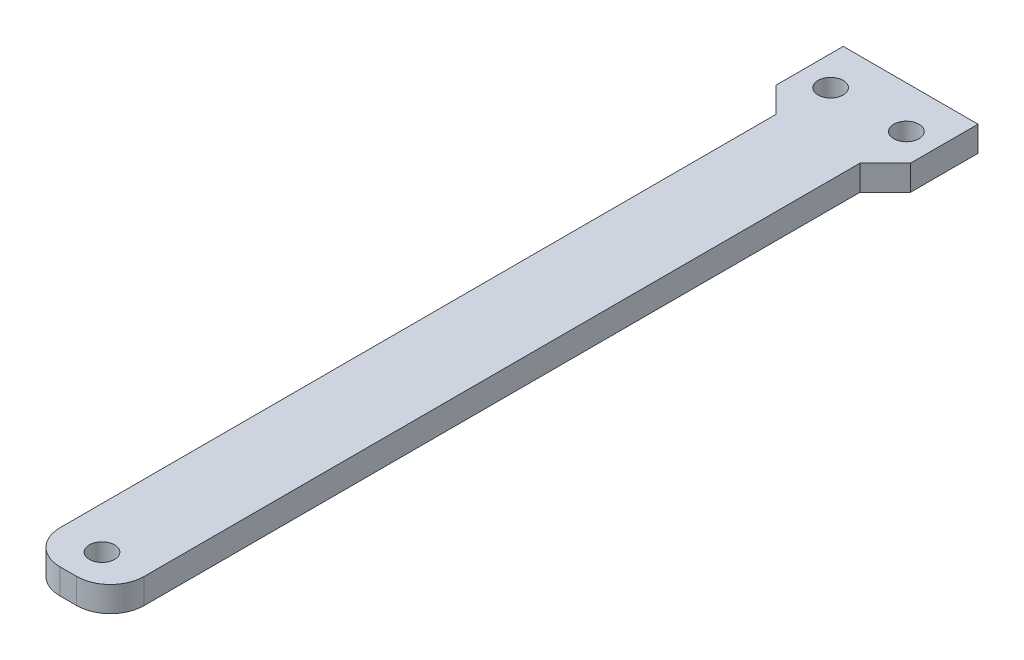
ISO-10303-21;
HEADER;
FILE_DESCRIPTION(('STEP AP214'),'2;1');
FILE_NAME('part.step','',(''),(''),'','','');
FILE_SCHEMA(('AUTOMOTIVE_DESIGN { 1 0 10303 214 1 1 1 1 }'));
ENDSEC;
DATA;
#1=APPLICATION_CONTEXT('core data for automotive mechanical design processes');
#2=APPLICATION_PROTOCOL_DEFINITION('international standard','automotive_design',2000,#1);
#3=PRODUCT_CONTEXT('',#1,'mechanical');
#4=PRODUCT('Part','Part','',(#3));
#5=PRODUCT_RELATED_PRODUCT_CATEGORY('part','',(#4));
#6=PRODUCT_DEFINITION_FORMATION('','',#4);
#7=PRODUCT_DEFINITION_CONTEXT('part definition',#1,'design');
#8=PRODUCT_DEFINITION('design','',#6,#7);
#9=PRODUCT_DEFINITION_SHAPE('','',#8);
#10=(LENGTH_UNIT() NAMED_UNIT(*) SI_UNIT(.MILLI.,.METRE.));
#11=(NAMED_UNIT(*) PLANE_ANGLE_UNIT() SI_UNIT($,.RADIAN.));
#12=(NAMED_UNIT(*) SI_UNIT($,.STERADIAN.) SOLID_ANGLE_UNIT());
#13=UNCERTAINTY_MEASURE_WITH_UNIT(LENGTH_MEASURE(1.E-05),#10,'distance_accuracy_value','');
#14=(GEOMETRIC_REPRESENTATION_CONTEXT(3) GLOBAL_UNCERTAINTY_ASSIGNED_CONTEXT((#13)) GLOBAL_UNIT_ASSIGNED_CONTEXT((#10,
#11,#12)) REPRESENTATION_CONTEXT('',''));
#15=CARTESIAN_POINT('',(0.,0.,0.));
#16=DIRECTION('',(0.,0.,1.));
#17=DIRECTION('',(1.,0.,0.));
#18=AXIS2_PLACEMENT_3D('',#15,#16,#17);
#19=CARTESIAN_POINT('',(5.,3.,-46.));
#20=DIRECTION('',(-1.,0.,0.));
#21=DIRECTION('',(0.,0.,-1.));
#22=AXIS2_PLACEMENT_3D('',#19,#20,#21);
#23=PLANE('',#22);
#24=DIRECTION('',(0.,0.,1.));
#25=VECTOR('',#24,1.);
#26=CARTESIAN_POINT('',(5.,0.,-46.));
#27=LINE('',#26,#25);
#28=CARTESIAN_POINT('',(5.,0.,-43.));
#29=VERTEX_POINT('',#28);
#30=CARTESIAN_POINT('',(5.,0.,42.));
#31=VERTEX_POINT('',#30);
#32=EDGE_CURVE('E190',#29,#31,#27,.T.);
#33=ORIENTED_EDGE('',*,*,#32,.F.);
#34=DIRECTION('',(0.,-1.,0.));
#35=VECTOR('',#34,1.);
#36=CARTESIAN_POINT('',(5.,0.,-43.));
#37=LINE('',#36,#35);
#38=CARTESIAN_POINT('',(5.,3.,-43.));
#39=VERTEX_POINT('',#38);
#40=EDGE_CURVE('E140',#39,#29,#37,.T.);
#41=ORIENTED_EDGE('',*,*,#40,.F.);
#42=DIRECTION('',(0.,0.,1.));
#43=VECTOR('',#42,1.);
#44=CARTESIAN_POINT('',(5.,3.,-46.));
#45=LINE('',#44,#43);
#46=CARTESIAN_POINT('',(5.,3.,42.));
#47=VERTEX_POINT('',#46);
#48=EDGE_CURVE('E178',#39,#47,#45,.T.);
#49=ORIENTED_EDGE('',*,*,#48,.T.);
#50=DIRECTION('',(0.,-1.,0.));
#51=VECTOR('',#50,1.);
#52=CARTESIAN_POINT('',(5.,3.,42.));
#53=LINE('',#52,#51);
#54=EDGE_CURVE('E163',#31,#47,#53,.F.);
#55=ORIENTED_EDGE('',*,*,#54,.F.);
#56=EDGE_LOOP('',(#33,#41,#49,#55));
#57=FACE_BOUND('',#56,.T.);
#58=ADVANCED_FACE('F37',(#57),#23,.F.);
#59=CARTESIAN_POINT('',(-5.,3.,46.));
#60=DIRECTION('',(0.,0.,-1.));
#61=DIRECTION('',(1.,0.,0.));
#62=AXIS2_PLACEMENT_3D('',#59,#60,#61);
#63=PLANE('',#62);
#64=DIRECTION('',(-1.,0.,0.));
#65=VECTOR('',#64,1.);
#66=CARTESIAN_POINT('',(-5.,3.,46.));
#67=LINE('',#66,#65);
#68=CARTESIAN_POINT('',(1.,3.,46.));
#69=VERTEX_POINT('',#68);
#70=CARTESIAN_POINT('',(-0.999999999999999,3.,46.));
#71=VERTEX_POINT('',#70);
#72=EDGE_CURVE('E175',#69,#71,#67,.T.);
#73=ORIENTED_EDGE('',*,*,#72,.T.);
#74=DIRECTION('',(0.,-1.,0.));
#75=VECTOR('',#74,1.);
#76=CARTESIAN_POINT('',(-0.999999999999999,3.,46.));
#77=LINE('',#76,#75);
#78=CARTESIAN_POINT('',(-0.999999999999999,0.,46.));
#79=VERTEX_POINT('',#78);
#80=EDGE_CURVE('E124',#79,#71,#77,.F.);
#81=ORIENTED_EDGE('',*,*,#80,.F.);
#82=DIRECTION('',(-1.,0.,0.));
#83=VECTOR('',#82,1.);
#84=CARTESIAN_POINT('',(-5.,0.,46.));
#85=LINE('',#84,#83);
#86=CARTESIAN_POINT('',(1.,0.,46.));
#87=VERTEX_POINT('',#86);
#88=EDGE_CURVE('E177',#87,#79,#85,.T.);
#89=ORIENTED_EDGE('',*,*,#88,.F.);
#90=DIRECTION('',(0.,-1.,0.));
#91=VECTOR('',#90,1.);
#92=CARTESIAN_POINT('',(1.,3.,46.));
#93=LINE('',#92,#91);
#94=EDGE_CURVE('E156',#69,#87,#93,.T.);
#95=ORIENTED_EDGE('',*,*,#94,.F.);
#96=EDGE_LOOP('',(#73,#81,#89,#95));
#97=FACE_BOUND('',#96,.T.);
#98=ADVANCED_FACE('F173',(#97),#63,.F.);
#99=CARTESIAN_POINT('',(-5.,3.,-46.));
#100=DIRECTION('',(1.,0.,0.));
#101=DIRECTION('',(0.,0.,1.));
#102=AXIS2_PLACEMENT_3D('',#99,#100,#101);
#103=PLANE('',#102);
#104=DIRECTION('',(0.,0.,-1.));
#105=VECTOR('',#104,1.);
#106=CARTESIAN_POINT('',(-5.,3.,-46.));
#107=LINE('',#106,#105);
#108=CARTESIAN_POINT('',(-5.,3.,42.));
#109=VERTEX_POINT('',#108);
#110=CARTESIAN_POINT('',(-5.,3.,-43.));
#111=VERTEX_POINT('',#110);
#112=EDGE_CURVE('E135',#109,#111,#107,.T.);
#113=ORIENTED_EDGE('',*,*,#112,.T.);
#114=DIRECTION('',(0.,1.,0.));
#115=VECTOR('',#114,1.);
#116=CARTESIAN_POINT('',(-5.,3.,-43.));
#117=LINE('',#116,#115);
#118=CARTESIAN_POINT('',(-5.,0.,-43.));
#119=VERTEX_POINT('',#118);
#120=EDGE_CURVE('E121',#119,#111,#117,.T.);
#121=ORIENTED_EDGE('',*,*,#120,.F.);
#122=DIRECTION('',(0.,0.,-1.));
#123=VECTOR('',#122,1.);
#124=CARTESIAN_POINT('',(-5.,0.,-46.));
#125=LINE('',#124,#123);
#126=CARTESIAN_POINT('',(-5.,0.,42.));
#127=VERTEX_POINT('',#126);
#128=EDGE_CURVE('E195',#127,#119,#125,.T.);
#129=ORIENTED_EDGE('',*,*,#128,.F.);
#130=DIRECTION('',(0.,-1.,0.));
#131=VECTOR('',#130,1.);
#132=CARTESIAN_POINT('',(-5.,3.,42.));
#133=LINE('',#132,#131);
#134=EDGE_CURVE('E11',#109,#127,#133,.T.);
#135=ORIENTED_EDGE('',*,*,#134,.F.);
#136=EDGE_LOOP('',(#113,#121,#129,#135));
#137=FACE_BOUND('',#136,.T.);
#138=ADVANCED_FACE('F214',(#137),#103,.F.);
#139=CARTESIAN_POINT('',(-8.,3.,-54.));
#140=DIRECTION('',(1.,0.,0.));
#141=DIRECTION('',(0.,0.,1.));
#142=AXIS2_PLACEMENT_3D('',#139,#140,#141);
#143=PLANE('',#142);
#144=DIRECTION('',(0.,0.,-1.));
#145=VECTOR('',#144,1.);
#146=CARTESIAN_POINT('',(-8.,0.,-54.));
#147=LINE('',#146,#145);
#148=CARTESIAN_POINT('',(-8.,0.,-46.));
#149=VERTEX_POINT('',#148);
#150=CARTESIAN_POINT('',(-8.,0.,-54.));
#151=VERTEX_POINT('',#150);
#152=EDGE_CURVE('E139',#149,#151,#147,.T.);
#153=ORIENTED_EDGE('',*,*,#152,.F.);
#154=DIRECTION('',(0.,-1.,0.));
#155=VECTOR('',#154,1.);
#156=CARTESIAN_POINT('',(-8.,3.,-46.));
#157=LINE('',#156,#155);
#158=CARTESIAN_POINT('',(-8.,3.,-46.));
#159=VERTEX_POINT('',#158);
#160=EDGE_CURVE('E118',#159,#149,#157,.T.);
#161=ORIENTED_EDGE('',*,*,#160,.F.);
#162=DIRECTION('',(0.,0.,-1.));
#163=VECTOR('',#162,1.);
#164=CARTESIAN_POINT('',(-8.,3.,-54.));
#165=LINE('',#164,#163);
#166=CARTESIAN_POINT('',(-8.,3.,-54.));
#167=VERTEX_POINT('',#166);
#168=EDGE_CURVE('E128',#159,#167,#165,.T.);
#169=ORIENTED_EDGE('',*,*,#168,.T.);
#170=DIRECTION('',(0.,-1.,0.));
#171=VECTOR('',#170,1.);
#172=CARTESIAN_POINT('',(-8.,3.,-54.));
#173=LINE('',#172,#171);
#174=EDGE_CURVE('E141',#167,#151,#173,.T.);
#175=ORIENTED_EDGE('',*,*,#174,.T.);
#176=EDGE_LOOP('',(#153,#161,#169,#175));
#177=FACE_BOUND('',#176,.T.);
#178=ADVANCED_FACE('F137',(#177),#143,.F.);
#179=CARTESIAN_POINT('',(-8.,3.,-54.));
#180=DIRECTION('',(0.,0.,1.));
#181=DIRECTION('',(-1.,0.,0.));
#182=AXIS2_PLACEMENT_3D('',#179,#180,#181);
#183=PLANE('',#182);
#184=DIRECTION('',(1.,0.,0.));
#185=VECTOR('',#184,1.);
#186=CARTESIAN_POINT('',(-8.,0.,-54.));
#187=LINE('',#186,#185);
#188=CARTESIAN_POINT('',(8.,0.,-54.));
#189=VERTEX_POINT('',#188);
#190=EDGE_CURVE('E199',#151,#189,#187,.T.);
#191=ORIENTED_EDGE('',*,*,#190,.F.);
#192=ORIENTED_EDGE('',*,*,#174,.F.);
#193=DIRECTION('',(1.,0.,0.));
#194=VECTOR('',#193,1.);
#195=CARTESIAN_POINT('',(-8.,3.,-54.));
#196=LINE('',#195,#194);
#197=CARTESIAN_POINT('',(8.,3.,-54.));
#198=VERTEX_POINT('',#197);
#199=EDGE_CURVE('E131',#167,#198,#196,.T.);
#200=ORIENTED_EDGE('',*,*,#199,.T.);
#201=DIRECTION('',(0.,-1.,0.));
#202=VECTOR('',#201,1.);
#203=CARTESIAN_POINT('',(8.,3.,-54.));
#204=LINE('',#203,#202);
#205=EDGE_CURVE('E145',#198,#189,#204,.T.);
#206=ORIENTED_EDGE('',*,*,#205,.T.);
#207=EDGE_LOOP('',(#191,#192,#200,#206));
#208=FACE_BOUND('',#207,.T.);
#209=ADVANCED_FACE('F208',(#208),#183,.F.);
#210=CARTESIAN_POINT('',(8.,3.,-54.));
#211=DIRECTION('',(-1.,0.,0.));
#212=DIRECTION('',(0.,0.,-1.));
#213=AXIS2_PLACEMENT_3D('',#210,#211,#212);
#214=PLANE('',#213);
#215=DIRECTION('',(0.,0.,1.));
#216=VECTOR('',#215,1.);
#217=CARTESIAN_POINT('',(8.,0.,-54.));
#218=LINE('',#217,#216);
#219=CARTESIAN_POINT('',(8.,0.,-46.));
#220=VERTEX_POINT('',#219);
#221=EDGE_CURVE('E181',#189,#220,#218,.T.);
#222=ORIENTED_EDGE('',*,*,#221,.F.);
#223=ORIENTED_EDGE('',*,*,#205,.F.);
#224=DIRECTION('',(0.,0.,1.));
#225=VECTOR('',#224,1.);
#226=CARTESIAN_POINT('',(8.,3.,-54.));
#227=LINE('',#226,#225);
#228=CARTESIAN_POINT('',(8.,3.,-46.));
#229=VERTEX_POINT('',#228);
#230=EDGE_CURVE('E186',#198,#229,#227,.T.);
#231=ORIENTED_EDGE('',*,*,#230,.T.);
#232=DIRECTION('',(0.,-1.,0.));
#233=VECTOR('',#232,1.);
#234=CARTESIAN_POINT('',(8.,3.,-46.));
#235=LINE('',#234,#233);
#236=EDGE_CURVE('E189',#229,#220,#235,.T.);
#237=ORIENTED_EDGE('',*,*,#236,.T.);
#238=EDGE_LOOP('',(#222,#223,#231,#237));
#239=FACE_BOUND('',#238,.T.);
#240=ADVANCED_FACE('F221',(#239),#214,.F.);
#241=CARTESIAN_POINT('',(0.,3.,0.));
#242=DIRECTION('',(0.,-1.,0.));
#243=DIRECTION('',(0.,0.,1.));
#244=AXIS2_PLACEMENT_3D('',#241,#242,#243);
#245=PLANE('',#244);
#246=CARTESIAN_POINT('',(4.50000000000001,3.,-49.));
#247=DIRECTION('',(0.,-1.,0.));
#248=DIRECTION('',(0.,0.,-1.));
#249=AXIS2_PLACEMENT_3D('',#246,#247,#248);
#250=CIRCLE('',#249,1.5);
#251=CARTESIAN_POINT('',(4.50000000000001,3.,-50.5));
#252=VERTEX_POINT('',#251);
#253=EDGE_CURVE('E367',#252,#252,#250,.T.);
#254=ORIENTED_EDGE('',*,*,#253,.T.);
#255=EDGE_LOOP('',(#254));
#256=FACE_BOUND('',#255,.T.);
#257=CARTESIAN_POINT('',(0.,3.,42.));
#258=DIRECTION('',(0.,-1.,0.));
#259=DIRECTION('',(0.,0.,-1.));
#260=AXIS2_PLACEMENT_3D('',#257,#258,#259);
#261=CIRCLE('',#260,1.5);
#262=CARTESIAN_POINT('',(0.,3.,40.5));
#263=VERTEX_POINT('',#262);
#264=EDGE_CURVE('E363',#263,#263,#261,.T.);
#265=ORIENTED_EDGE('',*,*,#264,.T.);
#266=EDGE_LOOP('',(#265));
#267=FACE_BOUND('',#266,.T.);
#268=CARTESIAN_POINT('',(-4.49999999999999,3.,-49.));
#269=DIRECTION('',(0.,-1.,0.));
#270=DIRECTION('',(0.,0.,-1.));
#271=AXIS2_PLACEMENT_3D('',#268,#269,#270);
#272=CIRCLE('',#271,1.5);
#273=CARTESIAN_POINT('',(-4.49999999999999,3.,-50.5));
#274=VERTEX_POINT('',#273);
#275=EDGE_CURVE('E358',#274,#274,#272,.T.);
#276=ORIENTED_EDGE('',*,*,#275,.T.);
#277=EDGE_LOOP('',(#276));
#278=FACE_BOUND('',#277,.T.);
#279=ORIENTED_EDGE('',*,*,#48,.F.);
#280=DIRECTION('',(0.707106781186543,0.,-0.707106781186552));
#281=VECTOR('',#280,1.);
#282=CARTESIAN_POINT('',(-19.,3.,-18.9999999999997));
#283=LINE('',#282,#281);
#284=EDGE_CURVE('E152',#229,#39,#283,.F.);
#285=ORIENTED_EDGE('',*,*,#284,.F.);
#286=ORIENTED_EDGE('',*,*,#230,.F.);
#287=ORIENTED_EDGE('',*,*,#199,.F.);
#288=ORIENTED_EDGE('',*,*,#168,.F.);
#289=DIRECTION('',(0.707106781186551,0.,0.707106781186544));
#290=VECTOR('',#289,1.);
#291=CARTESIAN_POINT('',(19.,3.,-19.0000000000002));
#292=LINE('',#291,#290);
#293=EDGE_CURVE('E114',#111,#159,#292,.F.);
#294=ORIENTED_EDGE('',*,*,#293,.F.);
#295=ORIENTED_EDGE('',*,*,#112,.F.);
#296=CARTESIAN_POINT('',(-0.999999999999999,3.,42.));
#297=DIRECTION('',(0.,1.,0.));
#298=DIRECTION('',(0.,0.,1.));
#299=AXIS2_PLACEMENT_3D('',#296,#297,#298);
#300=CIRCLE('',#299,4.);
#301=EDGE_CURVE('E51',#71,#109,#300,.F.);
#302=ORIENTED_EDGE('',*,*,#301,.F.);
#303=ORIENTED_EDGE('',*,*,#72,.F.);
#304=CARTESIAN_POINT('',(1.,3.,42.));
#305=DIRECTION('',(0.,1.,0.));
#306=DIRECTION('',(0.,0.,1.));
#307=AXIS2_PLACEMENT_3D('',#304,#305,#306);
#308=CIRCLE('',#307,4.);
#309=EDGE_CURVE('E45',#47,#69,#308,.F.);
#310=ORIENTED_EDGE('',*,*,#309,.F.);
#311=EDGE_LOOP('',(#279,#285,#286,#287,#288,#294,#295,#302,#303,#310));
#312=FACE_BOUND('',#311,.T.);
#313=ADVANCED_FACE('F129',(#256,#267,#278,#312),#245,.F.);
#314=CARTESIAN_POINT('',(0.,0.,0.));
#315=DIRECTION('',(0.,-1.,0.));
#316=DIRECTION('',(0.,0.,1.));
#317=AXIS2_PLACEMENT_3D('',#314,#315,#316);
#318=PLANE('',#317);
#319=CARTESIAN_POINT('',(4.50000000000001,0.,-49.));
#320=DIRECTION('',(0.,-1.,0.));
#321=DIRECTION('',(0.,0.,-1.));
#322=AXIS2_PLACEMENT_3D('',#319,#320,#321);
#323=CIRCLE('',#322,1.5);
#324=CARTESIAN_POINT('',(4.50000000000001,0.,-50.5));
#325=VERTEX_POINT('',#324);
#326=EDGE_CURVE('E351',#325,#325,#323,.T.);
#327=ORIENTED_EDGE('',*,*,#326,.F.);
#328=EDGE_LOOP('',(#327));
#329=FACE_BOUND('',#328,.T.);
#330=CARTESIAN_POINT('',(0.,0.,42.));
#331=DIRECTION('',(0.,-1.,0.));
#332=DIRECTION('',(0.,0.,-1.));
#333=AXIS2_PLACEMENT_3D('',#330,#331,#332);
#334=CIRCLE('',#333,1.5);
#335=CARTESIAN_POINT('',(0.,0.,40.5));
#336=VERTEX_POINT('',#335);
#337=EDGE_CURVE('E355',#336,#336,#334,.T.);
#338=ORIENTED_EDGE('',*,*,#337,.F.);
#339=EDGE_LOOP('',(#338));
#340=FACE_BOUND('',#339,.T.);
#341=CARTESIAN_POINT('',(-4.49999999999999,0.,-49.));
#342=DIRECTION('',(0.,-1.,0.));
#343=DIRECTION('',(0.,0.,-1.));
#344=AXIS2_PLACEMENT_3D('',#341,#342,#343);
#345=CIRCLE('',#344,1.5);
#346=CARTESIAN_POINT('',(-4.49999999999999,0.,-50.5));
#347=VERTEX_POINT('',#346);
#348=EDGE_CURVE('E193',#347,#347,#345,.T.);
#349=ORIENTED_EDGE('',*,*,#348,.F.);
#350=EDGE_LOOP('',(#349));
#351=FACE_BOUND('',#350,.T.);
#352=ORIENTED_EDGE('',*,*,#88,.T.);
#353=CARTESIAN_POINT('',(-0.999999999999999,0.,42.));
#354=DIRECTION('',(0.,1.,0.));
#355=DIRECTION('',(0.,0.,1.));
#356=AXIS2_PLACEMENT_3D('',#353,#354,#355);
#357=CIRCLE('',#356,4.);
#358=EDGE_CURVE('E159',#127,#79,#357,.T.);
#359=ORIENTED_EDGE('',*,*,#358,.F.);
#360=ORIENTED_EDGE('',*,*,#128,.T.);
#361=DIRECTION('',(-0.707106781186551,0.,-0.707106781186544));
#362=VECTOR('',#361,1.);
#363=CARTESIAN_POINT('',(-8.00000000000003,0.,-46.));
#364=LINE('',#363,#362);
#365=EDGE_CURVE('E125',#149,#119,#364,.F.);
#366=ORIENTED_EDGE('',*,*,#365,.F.);
#367=ORIENTED_EDGE('',*,*,#152,.T.);
#368=ORIENTED_EDGE('',*,*,#190,.T.);
#369=ORIENTED_EDGE('',*,*,#221,.T.);
#370=DIRECTION('',(-0.707106781186543,0.,0.707106781186552));
#371=VECTOR('',#370,1.);
#372=CARTESIAN_POINT('',(5.,0.,-43.));
#373=LINE('',#372,#371);
#374=EDGE_CURVE('E150',#29,#220,#373,.F.);
#375=ORIENTED_EDGE('',*,*,#374,.F.);
#376=ORIENTED_EDGE('',*,*,#32,.T.);
#377=CARTESIAN_POINT('',(1.,0.,42.));
#378=DIRECTION('',(0.,1.,0.));
#379=DIRECTION('',(0.,0.,1.));
#380=AXIS2_PLACEMENT_3D('',#377,#378,#379);
#381=CIRCLE('',#380,4.);
#382=EDGE_CURVE('E161',#87,#31,#381,.T.);
#383=ORIENTED_EDGE('',*,*,#382,.F.);
#384=EDGE_LOOP('',(#352,#359,#360,#366,#367,#368,#369,#375,#376,#383));
#385=FACE_BOUND('',#384,.T.);
#386=ADVANCED_FACE('F211',(#329,#340,#351,#385),#318,.T.);
#387=CARTESIAN_POINT('',(-4.49999999999999,3.,-49.));
#388=DIRECTION('',(0.,1.,0.));
#389=DIRECTION('',(0.,0.,-1.));
#390=AXIS2_PLACEMENT_3D('',#387,#388,#389);
#391=CYLINDRICAL_SURFACE('',#390,1.5);
#392=ORIENTED_EDGE('',*,*,#348,.T.);
#393=EDGE_LOOP('',(#392));
#394=FACE_BOUND('',#393,.T.);
#395=ORIENTED_EDGE('',*,*,#275,.F.);
#396=EDGE_LOOP('',(#395));
#397=FACE_BOUND('',#396,.T.);
#398=ADVANCED_FACE('F285',(#394,#397),#391,.F.);
#399=CARTESIAN_POINT('',(0.,3.,42.));
#400=DIRECTION('',(0.,1.,0.));
#401=DIRECTION('',(0.,0.,-1.));
#402=AXIS2_PLACEMENT_3D('',#399,#400,#401);
#403=CYLINDRICAL_SURFACE('',#402,1.5);
#404=ORIENTED_EDGE('',*,*,#337,.T.);
#405=EDGE_LOOP('',(#404));
#406=FACE_BOUND('',#405,.T.);
#407=ORIENTED_EDGE('',*,*,#264,.F.);
#408=EDGE_LOOP('',(#407));
#409=FACE_BOUND('',#408,.T.);
#410=ADVANCED_FACE('F275',(#406,#409),#403,.F.);
#411=CARTESIAN_POINT('',(4.50000000000001,3.,-49.));
#412=DIRECTION('',(0.,1.,0.));
#413=DIRECTION('',(0.,0.,-1.));
#414=AXIS2_PLACEMENT_3D('',#411,#412,#413);
#415=CYLINDRICAL_SURFACE('',#414,1.5);
#416=ORIENTED_EDGE('',*,*,#326,.T.);
#417=EDGE_LOOP('',(#416));
#418=FACE_BOUND('',#417,.T.);
#419=ORIENTED_EDGE('',*,*,#253,.F.);
#420=EDGE_LOOP('',(#419));
#421=FACE_BOUND('',#420,.T.);
#422=ADVANCED_FACE('F242',(#418,#421),#415,.F.);
#423=CARTESIAN_POINT('',(5.,3.,-43.));
#424=DIRECTION('',(0.707106781186552,0.,0.707106781186543));
#425=DIRECTION('',(0.,1.,0.));
#426=AXIS2_PLACEMENT_3D('',#423,#424,#425);
#427=PLANE('',#426);
#428=ORIENTED_EDGE('',*,*,#284,.T.);
#429=ORIENTED_EDGE('',*,*,#40,.T.);
#430=ORIENTED_EDGE('',*,*,#374,.T.);
#431=ORIENTED_EDGE('',*,*,#236,.F.);
#432=EDGE_LOOP('',(#428,#429,#430,#431));
#433=FACE_BOUND('',#432,.T.);
#434=ADVANCED_FACE('F220',(#433),#427,.T.);
#435=CARTESIAN_POINT('',(-8.00000000000003,3.,-46.));
#436=DIRECTION('',(-0.707106781186544,0.,0.707106781186551));
#437=DIRECTION('',(0.,1.,0.));
#438=AXIS2_PLACEMENT_3D('',#435,#436,#437);
#439=PLANE('',#438);
#440=ORIENTED_EDGE('',*,*,#293,.T.);
#441=ORIENTED_EDGE('',*,*,#160,.T.);
#442=ORIENTED_EDGE('',*,*,#365,.T.);
#443=ORIENTED_EDGE('',*,*,#120,.T.);
#444=EDGE_LOOP('',(#440,#441,#442,#443));
#445=FACE_BOUND('',#444,.T.);
#446=ADVANCED_FACE('F116',(#445),#439,.T.);
#447=CARTESIAN_POINT('',(1.,3.,42.));
#448=DIRECTION('',(0.,-1.,0.));
#449=DIRECTION('',(0.,0.,1.));
#450=AXIS2_PLACEMENT_3D('',#447,#448,#449);
#451=CYLINDRICAL_SURFACE('',#450,4.);
#452=ORIENTED_EDGE('',*,*,#309,.T.);
#453=ORIENTED_EDGE('',*,*,#94,.T.);
#454=ORIENTED_EDGE('',*,*,#382,.T.);
#455=ORIENTED_EDGE('',*,*,#54,.T.);
#456=EDGE_LOOP('',(#452,#453,#454,#455));
#457=FACE_BOUND('',#456,.T.);
#458=ADVANCED_FACE('F167',(#457),#451,.T.);
#459=CARTESIAN_POINT('',(-0.999999999999999,3.,42.));
#460=DIRECTION('',(0.,-1.,0.));
#461=DIRECTION('',(0.,0.,1.));
#462=AXIS2_PLACEMENT_3D('',#459,#460,#461);
#463=CYLINDRICAL_SURFACE('',#462,4.);
#464=ORIENTED_EDGE('',*,*,#301,.T.);
#465=ORIENTED_EDGE('',*,*,#134,.T.);
#466=ORIENTED_EDGE('',*,*,#358,.T.);
#467=ORIENTED_EDGE('',*,*,#80,.T.);
#468=EDGE_LOOP('',(#464,#465,#466,#467));
#469=FACE_BOUND('',#468,.T.);
#470=ADVANCED_FACE('F39',(#469),#463,.T.);
#471=CLOSED_SHELL('',(#58,#98,#138,#178,#209,#240,#313,#386,#398,#410,#422,#434,#446,#458,#470));
#472=MANIFOLD_SOLID_BREP('B2',#471);
#473=ADVANCED_BREP_SHAPE_REPRESENTATION('',(#18,#472),#14);
#474=SHAPE_DEFINITION_REPRESENTATION(#9,#473);
ENDSEC;
END-ISO-10303-21;
